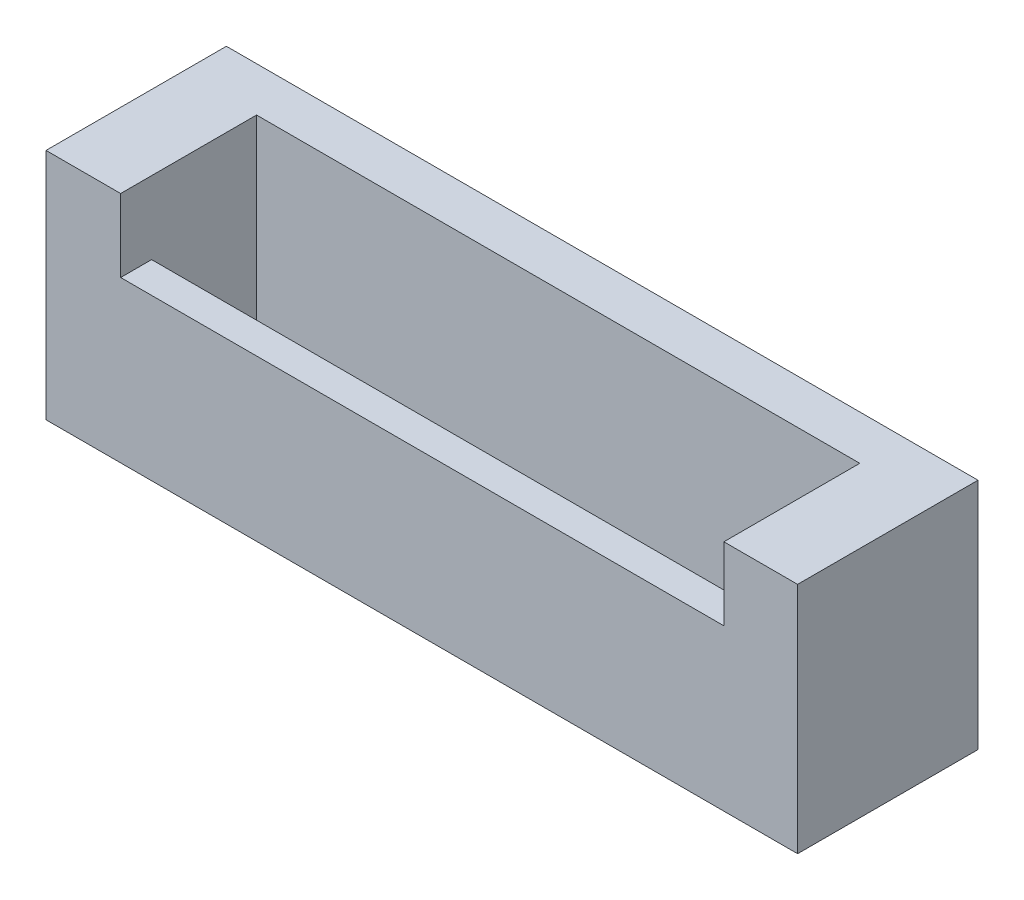
ISO-10303-21;
HEADER;
FILE_DESCRIPTION(('STEP AP214'),'2;1');
FILE_NAME('part.step','',(''),(''),'','','');
FILE_SCHEMA(('AUTOMOTIVE_DESIGN { 1 0 10303 214 1 1 1 1 }'));
ENDSEC;
DATA;
#1=APPLICATION_CONTEXT('core data for automotive mechanical design processes');
#2=APPLICATION_PROTOCOL_DEFINITION('international standard','automotive_design',2000,#1);
#3=PRODUCT_CONTEXT('',#1,'mechanical');
#4=PRODUCT('Part','Part','',(#3));
#5=PRODUCT_RELATED_PRODUCT_CATEGORY('part','',(#4));
#6=PRODUCT_DEFINITION_FORMATION('','',#4);
#7=PRODUCT_DEFINITION_CONTEXT('part definition',#1,'design');
#8=PRODUCT_DEFINITION('design','',#6,#7);
#9=PRODUCT_DEFINITION_SHAPE('','',#8);
#10=(LENGTH_UNIT() NAMED_UNIT(*) SI_UNIT(.MILLI.,.METRE.));
#11=(NAMED_UNIT(*) PLANE_ANGLE_UNIT() SI_UNIT($,.RADIAN.));
#12=(NAMED_UNIT(*) SI_UNIT($,.STERADIAN.) SOLID_ANGLE_UNIT());
#13=UNCERTAINTY_MEASURE_WITH_UNIT(LENGTH_MEASURE(1.E-05),#10,'distance_accuracy_value','');
#14=(GEOMETRIC_REPRESENTATION_CONTEXT(3) GLOBAL_UNCERTAINTY_ASSIGNED_CONTEXT((#13)) GLOBAL_UNIT_ASSIGNED_CONTEXT((#10,
#11,#12)) REPRESENTATION_CONTEXT('',''));
#15=CARTESIAN_POINT('',(0.,0.,0.));
#16=DIRECTION('',(0.,0.,1.));
#17=DIRECTION('',(1.,0.,0.));
#18=AXIS2_PLACEMENT_3D('',#15,#16,#17);
#19=CARTESIAN_POINT('',(-45.0346419403886,0.519999999999996,9.93818013704988));
#20=DIRECTION('',(0.,0.,1.));
#21=DIRECTION('',(1.,0.,0.));
#22=AXIS2_PLACEMENT_3D('',#19,#20,#21);
#23=PLANE('',#22);
#24=DIRECTION('',(1.,0.,0.));
#25=VECTOR('',#24,1.);
#26=CARTESIAN_POINT('',(-4.90464194038864,10.68,9.93818013704988));
#27=LINE('',#26,#25);
#28=CARTESIAN_POINT('',(-45.0346419403886,10.68,9.93818013704988));
#29=VERTEX_POINT('',#28);
#30=CARTESIAN_POINT('',(-4.90464194038864,10.68,9.93818013704988));
#31=VERTEX_POINT('',#30);
#32=EDGE_CURVE('E142',#29,#31,#27,.T.);
#33=ORIENTED_EDGE('',*,*,#32,.T.);
#34=DIRECTION('',(0.,1.,0.));
#35=VECTOR('',#34,1.);
#36=CARTESIAN_POINT('',(-4.90464194038864,0.519999999999996,9.93818013704988));
#37=LINE('',#36,#35);
#38=CARTESIAN_POINT('',(-4.90464194038864,0.519999999999996,9.93818013704988));
#39=VERTEX_POINT('',#38);
#40=EDGE_CURVE('E231',#39,#31,#37,.T.);
#41=ORIENTED_EDGE('',*,*,#40,.F.);
#42=DIRECTION('',(1.,0.,0.));
#43=VECTOR('',#42,1.);
#44=CARTESIAN_POINT('',(-45.0346419403886,0.519999999999996,9.93818013704988));
#45=LINE('',#44,#43);
#46=CARTESIAN_POINT('',(-45.0346419403886,0.519999999999996,9.93818013704988));
#47=VERTEX_POINT('',#46);
#48=EDGE_CURVE('E208',#47,#39,#45,.T.);
#49=ORIENTED_EDGE('',*,*,#48,.F.);
#50=DIRECTION('',(0.,1.,0.));
#51=VECTOR('',#50,1.);
#52=CARTESIAN_POINT('',(-45.0346419403886,0.519999999999996,9.93818013704988));
#53=LINE('',#52,#51);
#54=EDGE_CURVE('E220',#47,#29,#53,.T.);
#55=ORIENTED_EDGE('',*,*,#54,.T.);
#56=EDGE_LOOP('',(#33,#41,#49,#55));
#57=FACE_BOUND('',#56,.T.);
#58=ADVANCED_FACE('F42',(#57),#23,.F.);
#59=CARTESIAN_POINT('',(0.,15.52,0.));
#60=DIRECTION('',(-1.,0.,0.));
#61=DIRECTION('',(0.,0.,1.));
#62=AXIS2_PLACEMENT_3D('',#59,#60,#61);
#63=PLANE('',#62);
#64=DIRECTION('',(0.,0.,-1.));
#65=VECTOR('',#64,1.);
#66=CARTESIAN_POINT('',(0.,0.,0.));
#67=LINE('',#66,#65);
#68=CARTESIAN_POINT('',(0.,0.,12.));
#69=VERTEX_POINT('',#68);
#70=CARTESIAN_POINT('',(0.,0.,0.));
#71=VERTEX_POINT('',#70);
#72=EDGE_CURVE('E166',#69,#71,#67,.T.);
#73=ORIENTED_EDGE('',*,*,#72,.T.);
#74=DIRECTION('',(0.,-1.,0.));
#75=VECTOR('',#74,1.);
#76=CARTESIAN_POINT('',(0.,15.52,0.));
#77=LINE('',#76,#75);
#78=CARTESIAN_POINT('',(0.,15.52,0.));
#79=VERTEX_POINT('',#78);
#80=EDGE_CURVE('E13',#79,#71,#77,.T.);
#81=ORIENTED_EDGE('',*,*,#80,.F.);
#82=DIRECTION('',(0.,0.,-1.));
#83=VECTOR('',#82,1.);
#84=CARTESIAN_POINT('',(0.,15.52,0.));
#85=LINE('',#84,#83);
#86=CARTESIAN_POINT('',(0.,15.52,12.));
#87=VERTEX_POINT('',#86);
#88=EDGE_CURVE('E177',#87,#79,#85,.T.);
#89=ORIENTED_EDGE('',*,*,#88,.F.);
#90=DIRECTION('',(0.,-1.,0.));
#91=VECTOR('',#90,1.);
#92=CARTESIAN_POINT('',(0.,15.52,12.));
#93=LINE('',#92,#91);
#94=EDGE_CURVE('E157',#87,#69,#93,.T.);
#95=ORIENTED_EDGE('',*,*,#94,.T.);
#96=EDGE_LOOP('',(#73,#81,#89,#95));
#97=FACE_BOUND('',#96,.T.);
#98=ADVANCED_FACE('F44',(#97),#63,.F.);
#99=CARTESIAN_POINT('',(0.,15.52,0.));
#100=DIRECTION('',(0.,0.,1.));
#101=DIRECTION('',(1.,0.,0.));
#102=AXIS2_PLACEMENT_3D('',#99,#100,#101);
#103=PLANE('',#102);
#104=DIRECTION('',(-1.,0.,0.));
#105=VECTOR('',#104,1.);
#106=CARTESIAN_POINT('',(0.,0.,0.));
#107=LINE('',#106,#105);
#108=CARTESIAN_POINT('',(-50.,0.,0.));
#109=VERTEX_POINT('',#108);
#110=EDGE_CURVE('E170',#71,#109,#107,.T.);
#111=ORIENTED_EDGE('',*,*,#110,.T.);
#112=DIRECTION('',(0.,-1.,0.));
#113=VECTOR('',#112,1.);
#114=CARTESIAN_POINT('',(-50.,15.52,0.));
#115=LINE('',#114,#113);
#116=CARTESIAN_POINT('',(-50.,15.52,0.));
#117=VERTEX_POINT('',#116);
#118=EDGE_CURVE('E51',#117,#109,#115,.T.);
#119=ORIENTED_EDGE('',*,*,#118,.F.);
#120=DIRECTION('',(-1.,0.,0.));
#121=VECTOR('',#120,1.);
#122=CARTESIAN_POINT('',(0.,15.52,0.));
#123=LINE('',#122,#121);
#124=EDGE_CURVE('E96',#79,#117,#123,.T.);
#125=ORIENTED_EDGE('',*,*,#124,.F.);
#126=ORIENTED_EDGE('',*,*,#80,.T.);
#127=EDGE_LOOP('',(#111,#119,#125,#126));
#128=FACE_BOUND('',#127,.T.);
#129=ADVANCED_FACE('F267',(#128),#103,.F.);
#130=CARTESIAN_POINT('',(-50.,15.52,0.));
#131=DIRECTION('',(1.,0.,0.));
#132=DIRECTION('',(0.,0.,-1.));
#133=AXIS2_PLACEMENT_3D('',#130,#131,#132);
#134=PLANE('',#133);
#135=DIRECTION('',(0.,0.,1.));
#136=VECTOR('',#135,1.);
#137=CARTESIAN_POINT('',(-50.,0.,0.));
#138=LINE('',#137,#136);
#139=CARTESIAN_POINT('',(-50.,0.,12.));
#140=VERTEX_POINT('',#139);
#141=EDGE_CURVE('E173',#109,#140,#138,.T.);
#142=ORIENTED_EDGE('',*,*,#141,.T.);
#143=DIRECTION('',(0.,-1.,0.));
#144=VECTOR('',#143,1.);
#145=CARTESIAN_POINT('',(-50.,15.52,12.));
#146=LINE('',#145,#144);
#147=CARTESIAN_POINT('',(-50.,15.52,12.));
#148=VERTEX_POINT('',#147);
#149=EDGE_CURVE('E161',#148,#140,#146,.T.);
#150=ORIENTED_EDGE('',*,*,#149,.F.);
#151=DIRECTION('',(0.,0.,1.));
#152=VECTOR('',#151,1.);
#153=CARTESIAN_POINT('',(-50.,15.52,0.));
#154=LINE('',#153,#152);
#155=EDGE_CURVE('E154',#117,#148,#154,.T.);
#156=ORIENTED_EDGE('',*,*,#155,.F.);
#157=ORIENTED_EDGE('',*,*,#118,.T.);
#158=EDGE_LOOP('',(#142,#150,#156,#157));
#159=FACE_BOUND('',#158,.T.);
#160=ADVANCED_FACE('F184',(#159),#134,.F.);
#161=CARTESIAN_POINT('',(0.,15.52,12.));
#162=DIRECTION('',(0.,0.,-1.));
#163=DIRECTION('',(-1.,0.,0.));
#164=AXIS2_PLACEMENT_3D('',#161,#162,#163);
#165=PLANE('',#164);
#166=DIRECTION('',(1.,0.,0.));
#167=VECTOR('',#166,1.);
#168=CARTESIAN_POINT('',(0.,15.52,12.));
#169=LINE('',#168,#167);
#170=CARTESIAN_POINT('',(-4.90464194038864,15.52,12.));
#171=VERTEX_POINT('',#170);
#172=EDGE_CURVE('E67',#171,#87,#169,.T.);
#173=ORIENTED_EDGE('',*,*,#172,.F.);
#174=DIRECTION('',(0.,1.,0.));
#175=VECTOR('',#174,1.);
#176=CARTESIAN_POINT('',(-4.90464194038864,-39.66293171419,12.));
#177=LINE('',#176,#175);
#178=CARTESIAN_POINT('',(-4.90464194038864,10.68,12.));
#179=VERTEX_POINT('',#178);
#180=EDGE_CURVE('E150',#179,#171,#177,.T.);
#181=ORIENTED_EDGE('',*,*,#180,.F.);
#182=DIRECTION('',(-1.,0.,0.));
#183=VECTOR('',#182,1.);
#184=CARTESIAN_POINT('',(-4.90464194038864,10.68,12.));
#185=LINE('',#184,#183);
#186=CARTESIAN_POINT('',(-45.0346419403886,10.68,12.));
#187=VERTEX_POINT('',#186);
#188=EDGE_CURVE('E148',#179,#187,#185,.T.);
#189=ORIENTED_EDGE('',*,*,#188,.T.);
#190=DIRECTION('',(0.,1.,0.));
#191=VECTOR('',#190,1.);
#192=CARTESIAN_POINT('',(-45.0346419403886,-39.66293171419,12.));
#193=LINE('',#192,#191);
#194=CARTESIAN_POINT('',(-45.0346419403886,15.52,12.));
#195=VERTEX_POINT('',#194);
#196=EDGE_CURVE('E133',#187,#195,#193,.T.);
#197=ORIENTED_EDGE('',*,*,#196,.T.);
#198=EDGE_CURVE('E146',#148,#195,#169,.T.);
#199=ORIENTED_EDGE('',*,*,#198,.F.);
#200=ORIENTED_EDGE('',*,*,#149,.T.);
#201=DIRECTION('',(1.,0.,0.));
#202=VECTOR('',#201,1.);
#203=CARTESIAN_POINT('',(0.,0.,12.));
#204=LINE('',#203,#202);
#205=EDGE_CURVE('E89',#140,#69,#204,.T.);
#206=ORIENTED_EDGE('',*,*,#205,.T.);
#207=ORIENTED_EDGE('',*,*,#94,.F.);
#208=EDGE_LOOP('',(#173,#181,#189,#197,#199,#200,#206,#207));
#209=FACE_BOUND('',#208,.T.);
#210=ADVANCED_FACE('F145',(#209),#165,.F.);
#211=CARTESIAN_POINT('',(0.,15.52,0.));
#212=DIRECTION('',(0.,-1.,0.));
#213=DIRECTION('',(0.,0.,-1.));
#214=AXIS2_PLACEMENT_3D('',#211,#212,#213);
#215=PLANE('',#214);
#216=DIRECTION('',(0.,0.,-1.));
#217=VECTOR('',#216,1.);
#218=CARTESIAN_POINT('',(-4.90464194038864,15.52,2.95818013704988));
#219=LINE('',#218,#217);
#220=CARTESIAN_POINT('',(-4.90464194038864,15.52,2.95818013704988));
#221=VERTEX_POINT('',#220);
#222=EDGE_CURVE('E141',#171,#221,#219,.T.);
#223=ORIENTED_EDGE('',*,*,#222,.F.);
#224=ORIENTED_EDGE('',*,*,#172,.T.);
#225=ORIENTED_EDGE('',*,*,#88,.T.);
#226=ORIENTED_EDGE('',*,*,#124,.T.);
#227=ORIENTED_EDGE('',*,*,#155,.T.);
#228=ORIENTED_EDGE('',*,*,#198,.T.);
#229=DIRECTION('',(0.,0.,1.));
#230=VECTOR('',#229,1.);
#231=CARTESIAN_POINT('',(-45.0346419403886,15.52,2.95818013704988));
#232=LINE('',#231,#230);
#233=CARTESIAN_POINT('',(-45.0346419403886,15.52,2.95818013704988));
#234=VERTEX_POINT('',#233);
#235=EDGE_CURVE('E130',#234,#195,#232,.T.);
#236=ORIENTED_EDGE('',*,*,#235,.F.);
#237=DIRECTION('',(-1.,0.,0.));
#238=VECTOR('',#237,1.);
#239=CARTESIAN_POINT('',(-45.0346419403886,15.52,2.95818013704988));
#240=LINE('',#239,#238);
#241=EDGE_CURVE('E209',#221,#234,#240,.T.);
#242=ORIENTED_EDGE('',*,*,#241,.F.);
#243=EDGE_LOOP('',(#223,#224,#225,#226,#227,#228,#236,#242));
#244=FACE_BOUND('',#243,.T.);
#245=ADVANCED_FACE('F152',(#244),#215,.F.);
#246=CARTESIAN_POINT('',(0.,0.,0.));
#247=DIRECTION('',(0.,-1.,0.));
#248=DIRECTION('',(0.,0.,-1.));
#249=AXIS2_PLACEMENT_3D('',#246,#247,#248);
#250=PLANE('',#249);
#251=ORIENTED_EDGE('',*,*,#72,.F.);
#252=ORIENTED_EDGE('',*,*,#205,.F.);
#253=ORIENTED_EDGE('',*,*,#141,.F.);
#254=ORIENTED_EDGE('',*,*,#110,.F.);
#255=EDGE_LOOP('',(#251,#252,#253,#254));
#256=FACE_BOUND('',#255,.T.);
#257=ADVANCED_FACE('F187',(#256),#250,.T.);
#258=CARTESIAN_POINT('',(-45.0346419403886,0.519999999999996,2.95818013704988));
#259=DIRECTION('',(-1.,0.,0.));
#260=DIRECTION('',(0.,0.,1.));
#261=AXIS2_PLACEMENT_3D('',#258,#259,#260);
#262=PLANE('',#261);
#263=ORIENTED_EDGE('',*,*,#235,.T.);
#264=ORIENTED_EDGE('',*,*,#196,.F.);
#265=DIRECTION('',(0.,0.,-1.));
#266=VECTOR('',#265,1.);
#267=CARTESIAN_POINT('',(-45.0346419403886,10.68,9.93818013704988));
#268=LINE('',#267,#266);
#269=EDGE_CURVE('E195',#187,#29,#268,.T.);
#270=ORIENTED_EDGE('',*,*,#269,.T.);
#271=ORIENTED_EDGE('',*,*,#54,.F.);
#272=DIRECTION('',(0.,0.,1.));
#273=VECTOR('',#272,1.);
#274=CARTESIAN_POINT('',(-45.0346419403886,0.519999999999996,2.95818013704988));
#275=LINE('',#274,#273);
#276=CARTESIAN_POINT('',(-45.0346419403886,0.519999999999996,2.95818013704988));
#277=VERTEX_POINT('',#276);
#278=EDGE_CURVE('E204',#277,#47,#275,.T.);
#279=ORIENTED_EDGE('',*,*,#278,.F.);
#280=DIRECTION('',(0.,1.,0.));
#281=VECTOR('',#280,1.);
#282=CARTESIAN_POINT('',(-45.0346419403886,0.519999999999996,2.95818013704988));
#283=LINE('',#282,#281);
#284=EDGE_CURVE('E136',#277,#234,#283,.T.);
#285=ORIENTED_EDGE('',*,*,#284,.T.);
#286=EDGE_LOOP('',(#263,#264,#270,#271,#279,#285));
#287=FACE_BOUND('',#286,.T.);
#288=ADVANCED_FACE('F132',(#287),#262,.F.);
#289=CARTESIAN_POINT('',(-45.0346419403886,0.519999999999996,2.95818013704988));
#290=DIRECTION('',(0.,0.,-1.));
#291=DIRECTION('',(-1.,0.,0.));
#292=AXIS2_PLACEMENT_3D('',#289,#290,#291);
#293=PLANE('',#292);
#294=ORIENTED_EDGE('',*,*,#241,.T.);
#295=ORIENTED_EDGE('',*,*,#284,.F.);
#296=DIRECTION('',(-1.,0.,0.));
#297=VECTOR('',#296,1.);
#298=CARTESIAN_POINT('',(-45.0346419403886,0.519999999999996,2.95818013704988));
#299=LINE('',#298,#297);
#300=CARTESIAN_POINT('',(-4.90464194038864,0.519999999999996,2.95818013704988));
#301=VERTEX_POINT('',#300);
#302=EDGE_CURVE('E217',#301,#277,#299,.T.);
#303=ORIENTED_EDGE('',*,*,#302,.F.);
#304=DIRECTION('',(0.,1.,0.));
#305=VECTOR('',#304,1.);
#306=CARTESIAN_POINT('',(-4.90464194038864,0.519999999999996,2.95818013704988));
#307=LINE('',#306,#305);
#308=EDGE_CURVE('E228',#301,#221,#307,.T.);
#309=ORIENTED_EDGE('',*,*,#308,.T.);
#310=EDGE_LOOP('',(#294,#295,#303,#309));
#311=FACE_BOUND('',#310,.T.);
#312=ADVANCED_FACE('F252',(#311),#293,.F.);
#313=CARTESIAN_POINT('',(-4.90464194038864,0.519999999999996,2.95818013704988));
#314=DIRECTION('',(1.,0.,0.));
#315=DIRECTION('',(0.,0.,-1.));
#316=AXIS2_PLACEMENT_3D('',#313,#314,#315);
#317=PLANE('',#316);
#318=ORIENTED_EDGE('',*,*,#222,.T.);
#319=ORIENTED_EDGE('',*,*,#308,.F.);
#320=DIRECTION('',(0.,0.,-1.));
#321=VECTOR('',#320,1.);
#322=CARTESIAN_POINT('',(-4.90464194038864,0.519999999999996,2.95818013704988));
#323=LINE('',#322,#321);
#324=EDGE_CURVE('E213',#39,#301,#323,.T.);
#325=ORIENTED_EDGE('',*,*,#324,.F.);
#326=ORIENTED_EDGE('',*,*,#40,.T.);
#327=DIRECTION('',(0.,0.,1.));
#328=VECTOR('',#327,1.);
#329=CARTESIAN_POINT('',(-4.90464194038864,10.68,9.93818013704988));
#330=LINE('',#329,#328);
#331=EDGE_CURVE('E58',#31,#179,#330,.T.);
#332=ORIENTED_EDGE('',*,*,#331,.T.);
#333=ORIENTED_EDGE('',*,*,#180,.T.);
#334=EDGE_LOOP('',(#318,#319,#325,#326,#332,#333));
#335=FACE_BOUND('',#334,.T.);
#336=ADVANCED_FACE('F243',(#335),#317,.F.);
#337=CARTESIAN_POINT('',(0.,0.519999999999996,0.));
#338=DIRECTION('',(0.,1.,0.));
#339=DIRECTION('',(0.,0.,1.));
#340=AXIS2_PLACEMENT_3D('',#337,#338,#339);
#341=PLANE('',#340);
#342=ORIENTED_EDGE('',*,*,#278,.T.);
#343=ORIENTED_EDGE('',*,*,#48,.T.);
#344=ORIENTED_EDGE('',*,*,#324,.T.);
#345=ORIENTED_EDGE('',*,*,#302,.T.);
#346=EDGE_LOOP('',(#342,#343,#344,#345));
#347=FACE_BOUND('',#346,.T.);
#348=ADVANCED_FACE('F249',(#347),#341,.T.);
#349=CARTESIAN_POINT('',(0.,10.68,0.));
#350=DIRECTION('',(0.,1.,0.));
#351=DIRECTION('',(0.,0.,1.));
#352=AXIS2_PLACEMENT_3D('',#349,#350,#351);
#353=PLANE('',#352);
#354=ORIENTED_EDGE('',*,*,#331,.F.);
#355=ORIENTED_EDGE('',*,*,#32,.F.);
#356=ORIENTED_EDGE('',*,*,#269,.F.);
#357=ORIENTED_EDGE('',*,*,#188,.F.);
#358=EDGE_LOOP('',(#354,#355,#356,#357));
#359=FACE_BOUND('',#358,.T.);
#360=ADVANCED_FACE('F245',(#359),#353,.T.);
#361=CLOSED_SHELL('',(#58,#98,#129,#160,#210,#245,#257,#288,#312,#336,#348,#360));
#362=MANIFOLD_SOLID_BREP('B2',#361);
#363=ADVANCED_BREP_SHAPE_REPRESENTATION('',(#18,#362),#14);
#364=SHAPE_DEFINITION_REPRESENTATION(#9,#363);
ENDSEC;
END-ISO-10303-21;
